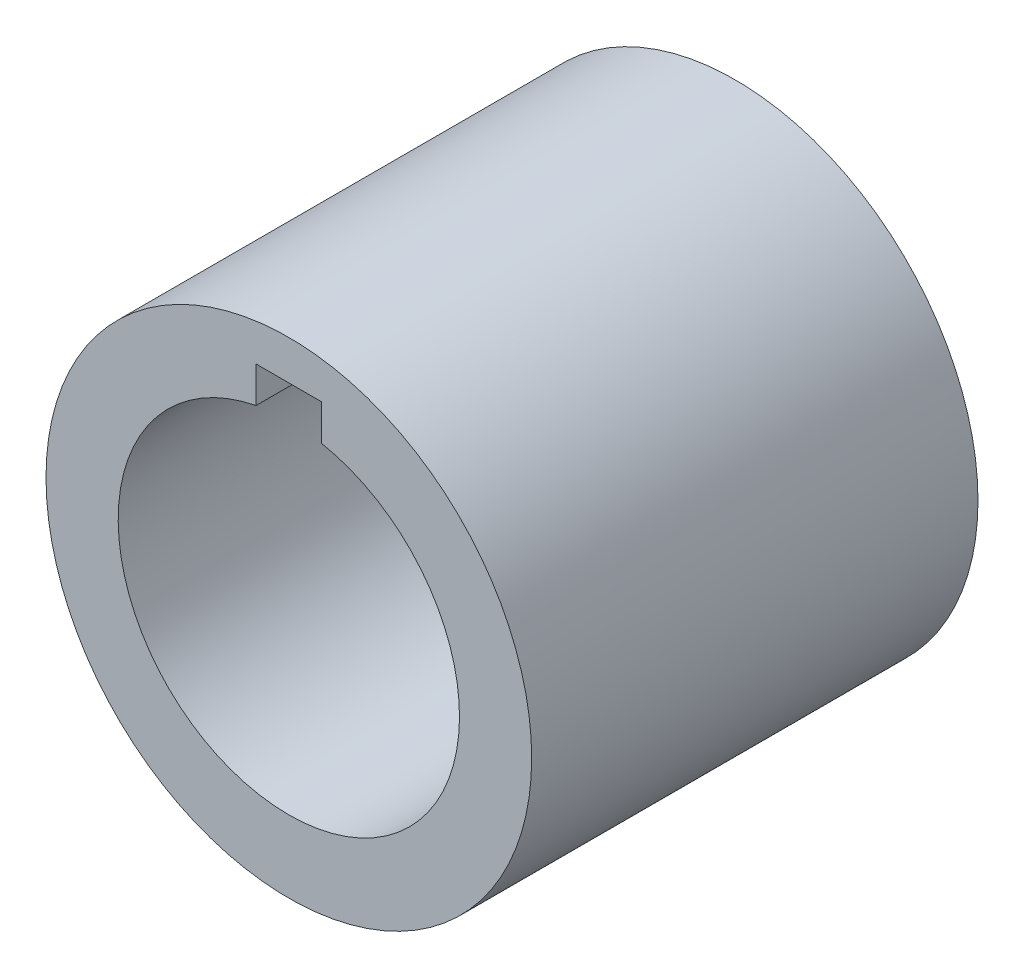
ISO-10303-21;
HEADER;
FILE_DESCRIPTION(('STEP AP214'),'2;1');
FILE_NAME('part.step','',(''),(''),'','','');
FILE_SCHEMA(('AUTOMOTIVE_DESIGN { 1 0 10303 214 1 1 1 1 }'));
ENDSEC;
DATA;
#1=APPLICATION_CONTEXT('core data for automotive mechanical design processes');
#2=APPLICATION_PROTOCOL_DEFINITION('international standard','automotive_design',2000,#1);
#3=PRODUCT_CONTEXT('',#1,'mechanical');
#4=PRODUCT('Part','Part','',(#3));
#5=PRODUCT_RELATED_PRODUCT_CATEGORY('part','',(#4));
#6=PRODUCT_DEFINITION_FORMATION('','',#4);
#7=PRODUCT_DEFINITION_CONTEXT('part definition',#1,'design');
#8=PRODUCT_DEFINITION('design','',#6,#7);
#9=PRODUCT_DEFINITION_SHAPE('','',#8);
#10=(LENGTH_UNIT() NAMED_UNIT(*) SI_UNIT(.MILLI.,.METRE.));
#11=(NAMED_UNIT(*) PLANE_ANGLE_UNIT() SI_UNIT($,.RADIAN.));
#12=(NAMED_UNIT(*) SI_UNIT($,.STERADIAN.) SOLID_ANGLE_UNIT());
#13=UNCERTAINTY_MEASURE_WITH_UNIT(LENGTH_MEASURE(1.E-05),#10,'distance_accuracy_value','');
#14=(GEOMETRIC_REPRESENTATION_CONTEXT(3) GLOBAL_UNCERTAINTY_ASSIGNED_CONTEXT((#13)) GLOBAL_UNIT_ASSIGNED_CONTEXT((#10,
#11,#12)) REPRESENTATION_CONTEXT('',''));
#15=CARTESIAN_POINT('',(0.,0.,0.));
#16=DIRECTION('',(0.,0.,1.));
#17=DIRECTION('',(1.,0.,0.));
#18=AXIS2_PLACEMENT_3D('',#15,#16,#17);
#19=CARTESIAN_POINT('',(0.,0.,34.));
#20=DIRECTION('',(0.,0.,1.));
#21=DIRECTION('',(1.,0.,0.));
#22=AXIS2_PLACEMENT_3D('',#19,#20,#21);
#23=PLANE('',#22);
#24=DIRECTION('',(0.,-1.,0.));
#25=VECTOR('',#24,1.);
#26=CARTESIAN_POINT('',(-2.5,15.5,34.));
#27=LINE('',#26,#25);
#28=CARTESIAN_POINT('',(-2.5,15.5,34.));
#29=VERTEX_POINT('',#28);
#30=CARTESIAN_POINT('',(-2.5,12.7573508221731,34.));
#31=VERTEX_POINT('',#30);
#32=EDGE_CURVE('E114',#29,#31,#27,.T.);
#33=ORIENTED_EDGE('',*,*,#32,.F.);
#34=DIRECTION('',(-1.,0.,0.));
#35=VECTOR('',#34,1.);
#36=CARTESIAN_POINT('',(2.5,15.5,34.));
#37=LINE('',#36,#35);
#38=CARTESIAN_POINT('',(2.5,15.5,34.));
#39=VERTEX_POINT('',#38);
#40=EDGE_CURVE('E96',#39,#29,#37,.T.);
#41=ORIENTED_EDGE('',*,*,#40,.F.);
#42=DIRECTION('',(0.,1.,0.));
#43=VECTOR('',#42,1.);
#44=CARTESIAN_POINT('',(2.5,15.5,34.));
#45=LINE('',#44,#43);
#46=CARTESIAN_POINT('',(2.5,12.7573508221731,34.));
#47=VERTEX_POINT('',#46);
#48=EDGE_CURVE('E106',#47,#39,#45,.T.);
#49=ORIENTED_EDGE('',*,*,#48,.F.);
#50=CARTESIAN_POINT('',(0.,0.,34.));
#51=DIRECTION('',(0.,0.,1.));
#52=DIRECTION('',(1.,0.,0.));
#53=AXIS2_PLACEMENT_3D('',#50,#51,#52);
#54=CIRCLE('',#53,13.);
#55=EDGE_CURVE('E124',#31,#47,#54,.T.);
#56=ORIENTED_EDGE('',*,*,#55,.F.);
#57=EDGE_LOOP('',(#33,#41,#49,#56));
#58=FACE_BOUND('',#57,.T.);
#59=CARTESIAN_POINT('',(0.,0.,34.));
#60=DIRECTION('',(0.,0.,1.));
#61=DIRECTION('',(1.,0.,0.));
#62=AXIS2_PLACEMENT_3D('',#59,#60,#61);
#63=CIRCLE('',#62,18.5);
#64=CARTESIAN_POINT('',(18.5,0.,34.));
#65=VERTEX_POINT('',#64);
#66=EDGE_CURVE('E131',#65,#65,#63,.T.);
#67=ORIENTED_EDGE('',*,*,#66,.T.);
#68=EDGE_LOOP('',(#67));
#69=FACE_BOUND('',#68,.T.);
#70=ADVANCED_FACE('F39',(#58,#69),#23,.T.);
#71=CARTESIAN_POINT('',(0.,0.,0.));
#72=DIRECTION('',(0.,0.,1.));
#73=DIRECTION('',(1.,0.,0.));
#74=AXIS2_PLACEMENT_3D('',#71,#72,#73);
#75=PLANE('',#74);
#76=CARTESIAN_POINT('',(0.,0.,0.));
#77=DIRECTION('',(0.,0.,1.));
#78=DIRECTION('',(1.,0.,0.));
#79=AXIS2_PLACEMENT_3D('',#76,#77,#78);
#80=CIRCLE('',#79,18.5);
#81=CARTESIAN_POINT('',(18.5,0.,0.));
#82=VERTEX_POINT('',#81);
#83=EDGE_CURVE('E127',#82,#82,#80,.T.);
#84=ORIENTED_EDGE('',*,*,#83,.F.);
#85=EDGE_LOOP('',(#84));
#86=FACE_BOUND('',#85,.T.);
#87=CARTESIAN_POINT('',(0.,0.,0.));
#88=DIRECTION('',(0.,0.,1.));
#89=DIRECTION('',(1.,0.,0.));
#90=AXIS2_PLACEMENT_3D('',#87,#88,#89);
#91=CIRCLE('',#90,13.);
#92=CARTESIAN_POINT('',(13.,0.,0.));
#93=VERTEX_POINT('',#92);
#94=EDGE_CURVE('E122',#93,#93,#91,.T.);
#95=ORIENTED_EDGE('',*,*,#94,.T.);
#96=EDGE_LOOP('',(#95));
#97=FACE_BOUND('',#96,.T.);
#98=ADVANCED_FACE('F173',(#86,#97),#75,.F.);
#99=CARTESIAN_POINT('',(0.,0.,34.));
#100=DIRECTION('',(0.,0.,-1.));
#101=DIRECTION('',(-1.,0.,0.));
#102=AXIS2_PLACEMENT_3D('',#99,#100,#101);
#103=CYLINDRICAL_SURFACE('',#102,18.5);
#104=ORIENTED_EDGE('',*,*,#66,.F.);
#105=EDGE_LOOP('',(#104));
#106=FACE_BOUND('',#105,.T.);
#107=ORIENTED_EDGE('',*,*,#83,.T.);
#108=EDGE_LOOP('',(#107));
#109=FACE_BOUND('',#108,.T.);
#110=ADVANCED_FACE('F168',(#106,#109),#103,.T.);
#111=CARTESIAN_POINT('',(0.,0.,34.));
#112=DIRECTION('',(0.,0.,-1.));
#113=DIRECTION('',(-1.,0.,0.));
#114=AXIS2_PLACEMENT_3D('',#111,#112,#113);
#115=CYLINDRICAL_SURFACE('',#114,13.);
#116=DIRECTION('',(0.,0.,-1.));
#117=VECTOR('',#116,1.);
#118=CARTESIAN_POINT('',(-2.5,12.7573508221731,34.));
#119=LINE('',#118,#117);
#120=CARTESIAN_POINT('',(-2.5,12.7573508221731,11.));
#121=VERTEX_POINT('',#120);
#122=EDGE_CURVE('E140',#31,#121,#119,.T.);
#123=ORIENTED_EDGE('',*,*,#122,.F.);
#124=ORIENTED_EDGE('',*,*,#55,.T.);
#125=DIRECTION('',(0.,0.,-1.));
#126=VECTOR('',#125,1.);
#127=CARTESIAN_POINT('',(2.5,12.7573508221731,34.));
#128=LINE('',#127,#126);
#129=CARTESIAN_POINT('',(2.5,12.7573508221731,11.));
#130=VERTEX_POINT('',#129);
#131=EDGE_CURVE('E109',#130,#47,#128,.F.);
#132=ORIENTED_EDGE('',*,*,#131,.F.);
#133=CARTESIAN_POINT('',(2.5,12.7573508221731,11.));
#134=CARTESIAN_POINT('',(2.50000749313691,12.7573450456409,10.930376957072));
#135=CARTESIAN_POINT('',(2.49709166098617,12.7579206462572,10.8607580089415));
#136=CARTESIAN_POINT('',(2.48547145414317,12.7601918390304,10.7220312456797));
#137=CARTESIAN_POINT('',(2.47676776215773,12.7618872990942,10.6529233712367));
#138=CARTESIAN_POINT('',(2.45364748353869,12.7663520747255,10.5158092137985));
#139=CARTESIAN_POINT('',(2.43923959093869,12.7691197559345,10.4478014175543));
#140=CARTESIAN_POINT('',(2.40483770151565,12.7756432139378,10.3132816422245));
#141=CARTESIAN_POINT('',(2.38484368928942,12.7793989934566,10.2467696672642));
#142=CARTESIAN_POINT('',(2.31667750071129,12.7919964341431,10.0501559423817));
#143=CARTESIAN_POINT('',(2.2603037839262,12.80217176971,9.9228740481664));
#144=CARTESIAN_POINT('',(2.12740627976695,12.8249232742152,9.67962717099967));
#145=CARTESIAN_POINT('',(2.05088032490189,12.8374997013649,9.56366340721926));
#146=CARTESIAN_POINT('',(1.87877941932844,12.8638188423628,9.34477119982209));
#147=CARTESIAN_POINT('',(1.78299416067924,12.8775733744673,9.24200923954284));
#148=CARTESIAN_POINT('',(1.5755353952948,12.9045964183195,9.05390123355371));
#149=CARTESIAN_POINT('',(1.46385889083329,12.9178648377716,8.96855848121636));
#150=CARTESIAN_POINT('',(1.22666942977458,12.9425500482732,8.81705440486016));
#151=CARTESIAN_POINT('',(1.10104960510487,12.9539506053294,8.75105768292481));
#152=CARTESIAN_POINT('',(0.840278199807231,12.9734720681168,8.64120465174492));
#153=CARTESIAN_POINT('',(0.705133292437257,12.9815952436673,8.59733301402814));
#154=CARTESIAN_POINT('',(0.474348960723125,12.9916763215095,8.54355798835741));
#155=CARTESIAN_POINT('',(0.380203770367686,12.9947809890247,8.52724231246427));
#156=CARTESIAN_POINT('',(0.190720733945989,12.9989498901616,8.50546011416931));
#157=CARTESIAN_POINT('',(0.0953842056251672,13.0000162066249,8.49998251692805));
#158=CARTESIAN_POINT('',(0.,13.,8.5));
#159=B_SPLINE_CURVE_WITH_KNOTS('',3,(#133,#134,#135,#136,#137,#138,#139,#140,#141,#142,#143,
#144,#145,#146,#147,#148,#149,#150,#151,#152,#153,#154,#155,#156,#157,#158),.UNSPECIFIED.,.F.,
.F.,(4,2,2,2,2,2,2,2,2,2,2,2,4),(0.,0.208798548816819,0.417572473175492,0.626029413116567,
0.834486927863297,1.25109426096649,1.66774642093583,2.08922298904812,2.51077917020598,
2.93582438105269,3.36057471053015,3.64676594828118,3.93266459152719),.UNSPECIFIED.);
#160=CARTESIAN_POINT('',(0.,13.,8.5));
#161=VERTEX_POINT('',#160);
#162=EDGE_CURVE('E152',#130,#161,#159,.T.);
#163=ORIENTED_EDGE('',*,*,#162,.T.);
#164=CARTESIAN_POINT('',(0.,13.,8.5));
#165=CARTESIAN_POINT('',(-0.0696350982249745,13.0000053696555,8.49999253561054));
#166=CARTESIAN_POINT('',(-0.139266168911171,12.9994406117374,8.50290934907913));
#167=CARTESIAN_POINT('',(-0.278017859484946,12.9972105966023,8.51453367263625));
#168=CARTESIAN_POINT('',(-0.347138536399277,12.9955454642716,8.5232405255884));
#169=CARTESIAN_POINT('',(-0.484280716143669,12.9911577141623,8.54636983086627));
#170=CARTESIAN_POINT('',(-0.552303704700347,12.9884366774137,8.56078373854093));
#171=CARTESIAN_POINT('',(-0.686854055750211,12.982017458871,8.5952005673537));
#172=CARTESIAN_POINT('',(-0.753381415760474,12.9783192754549,8.61520349776952));
#173=CARTESIAN_POINT('',(-0.950043599142356,12.9659012213978,8.68340204917518));
#174=CARTESIAN_POINT('',(-1.07735803818003,12.9558544471542,8.73980433975833));
#175=CARTESIAN_POINT('',(-1.32065864288852,12.9333231394576,8.87276862332707));
#176=CARTESIAN_POINT('',(-1.43664373519328,12.9208383753597,8.94933252393105));
#177=CARTESIAN_POINT('',(-1.6555116954017,12.8946332718273,9.121472025275));
#178=CARTESIAN_POINT('',(-1.75823468557063,12.880900746432,9.2172493908552));
#179=CARTESIAN_POINT('',(-1.94626757151752,12.853835759928,9.42467630545583));
#180=CARTESIAN_POINT('',(-2.03157398282963,12.8405033793289,9.53632902302985));
#181=CARTESIAN_POINT('',(-2.18303927866319,12.8156271907884,9.77349690144004));
#182=CARTESIAN_POINT('',(-2.24902708584108,12.8040997603598,9.89912307900289));
#183=CARTESIAN_POINT('',(-2.35886147115159,12.7843226805859,10.1599072959036));
#184=CARTESIAN_POINT('',(-2.40272365005539,12.7760707225839,10.2950585422699));
#185=CARTESIAN_POINT('',(-2.45647257870081,12.7658227606657,10.5258169151146));
#186=CARTESIAN_POINT('',(-2.47277651475444,12.7626638624849,10.6199276268343));
#187=CARTESIAN_POINT('',(-2.49454356996108,12.7584201927736,10.8093437616093));
#188=CARTESIAN_POINT('',(-2.50001754382728,12.7573333444976,10.9046478919777));
#189=CARTESIAN_POINT('',(-2.5,12.7573508221731,11.));
#190=B_SPLINE_CURVE_WITH_KNOTS('',3,(#164,#165,#166,#167,#168,#169,#170,#171,#172,#173,#174,
#175,#176,#177,#178,#179,#180,#181,#182,#183,#184,#185,#186,#187,#188,#189),.UNSPECIFIED.,.F.,
.F.,(4,2,2,2,2,2,2,2,2,2,2,2,4),(0.,0.208834879826145,0.417646062131662,0.626145785626669,
0.834645855230743,1.25134681942882,1.66808722453537,2.08945750226652,2.5109119994459,
2.93599303641877,3.36077392850344,3.64686261271974,3.93266440886109),.UNSPECIFIED.);
#191=EDGE_CURVE('E11',#161,#121,#190,.T.);
#192=ORIENTED_EDGE('',*,*,#191,.T.);
#193=EDGE_LOOP('',(#123,#124,#132,#163,#192));
#194=FACE_BOUND('',#193,.T.);
#195=ORIENTED_EDGE('',*,*,#94,.F.);
#196=EDGE_LOOP('',(#195));
#197=FACE_BOUND('',#196,.T.);
#198=ADVANCED_FACE('F162',(#194,#197),#115,.F.);
#199=CARTESIAN_POINT('',(-2.5,15.5,8.5));
#200=DIRECTION('',(-1.,0.,0.));
#201=DIRECTION('',(0.,-1.,0.));
#202=AXIS2_PLACEMENT_3D('',#199,#200,#201);
#203=PLANE('',#202);
#204=ORIENTED_EDGE('',*,*,#122,.T.);
#205=DIRECTION('',(0.,-1.,0.));
#206=VECTOR('',#205,1.);
#207=CARTESIAN_POINT('',(-2.5,15.5,11.));
#208=LINE('',#207,#206);
#209=CARTESIAN_POINT('',(-2.5,15.5,11.));
#210=VERTEX_POINT('',#209);
#211=EDGE_CURVE('E61',#121,#210,#208,.F.);
#212=ORIENTED_EDGE('',*,*,#211,.T.);
#213=DIRECTION('',(0.,0.,1.));
#214=VECTOR('',#213,1.);
#215=CARTESIAN_POINT('',(-2.5,15.5,8.5));
#216=LINE('',#215,#214);
#217=EDGE_CURVE('E103',#210,#29,#216,.T.);
#218=ORIENTED_EDGE('',*,*,#217,.T.);
#219=ORIENTED_EDGE('',*,*,#32,.T.);
#220=EDGE_LOOP('',(#204,#212,#218,#219));
#221=FACE_BOUND('',#220,.T.);
#222=ADVANCED_FACE('F167',(#221),#203,.F.);
#223=CARTESIAN_POINT('',(2.5,15.5,8.5));
#224=DIRECTION('',(0.,1.,0.));
#225=DIRECTION('',(0.,0.,1.));
#226=AXIS2_PLACEMENT_3D('',#223,#224,#225);
#227=PLANE('',#226);
#228=ORIENTED_EDGE('',*,*,#217,.F.);
#229=CARTESIAN_POINT('',(0.,15.5,11.));
#230=DIRECTION('',(0.,1.,0.));
#231=DIRECTION('',(0.,0.,1.));
#232=AXIS2_PLACEMENT_3D('',#229,#230,#231);
#233=CIRCLE('',#232,2.5);
#234=CARTESIAN_POINT('',(0.,15.5,8.5));
#235=VERTEX_POINT('',#234);
#236=EDGE_CURVE('E54',#210,#235,#233,.F.);
#237=ORIENTED_EDGE('',*,*,#236,.T.);
#238=CARTESIAN_POINT('',(0.,15.5,11.));
#239=DIRECTION('',(0.,1.,0.));
#240=DIRECTION('',(0.,0.,1.));
#241=AXIS2_PLACEMENT_3D('',#238,#239,#240);
#242=CIRCLE('',#241,2.5);
#243=CARTESIAN_POINT('',(2.5,15.5,11.));
#244=VERTEX_POINT('',#243);
#245=EDGE_CURVE('E99',#235,#244,#242,.F.);
#246=ORIENTED_EDGE('',*,*,#245,.T.);
#247=DIRECTION('',(0.,0.,1.));
#248=VECTOR('',#247,1.);
#249=CARTESIAN_POINT('',(2.5,15.5,8.5));
#250=LINE('',#249,#248);
#251=EDGE_CURVE('E92',#244,#39,#250,.T.);
#252=ORIENTED_EDGE('',*,*,#251,.T.);
#253=ORIENTED_EDGE('',*,*,#40,.T.);
#254=EDGE_LOOP('',(#228,#237,#246,#252,#253));
#255=FACE_BOUND('',#254,.T.);
#256=ADVANCED_FACE('F94',(#255),#227,.F.);
#257=CARTESIAN_POINT('',(2.5,15.5,8.5));
#258=DIRECTION('',(1.,0.,0.));
#259=DIRECTION('',(0.,1.,0.));
#260=AXIS2_PLACEMENT_3D('',#257,#258,#259);
#261=PLANE('',#260);
#262=ORIENTED_EDGE('',*,*,#251,.F.);
#263=DIRECTION('',(0.,1.,0.));
#264=VECTOR('',#263,1.);
#265=CARTESIAN_POINT('',(2.5,12.7573508221731,11.));
#266=LINE('',#265,#264);
#267=EDGE_CURVE('E149',#244,#130,#266,.F.);
#268=ORIENTED_EDGE('',*,*,#267,.T.);
#269=ORIENTED_EDGE('',*,*,#131,.T.);
#270=ORIENTED_EDGE('',*,*,#48,.T.);
#271=EDGE_LOOP('',(#262,#268,#269,#270));
#272=FACE_BOUND('',#271,.T.);
#273=ADVANCED_FACE('F107',(#272),#261,.F.);
#274=CARTESIAN_POINT('',(0.,0.,11.));
#275=DIRECTION('',(0.,-1.,0.));
#276=DIRECTION('',(1.,0.,0.));
#277=AXIS2_PLACEMENT_3D('',#274,#275,#276);
#278=CYLINDRICAL_SURFACE('',#277,2.5);
#279=ORIENTED_EDGE('',*,*,#162,.F.);
#280=ORIENTED_EDGE('',*,*,#267,.F.);
#281=ORIENTED_EDGE('',*,*,#245,.F.);
#282=DIRECTION('',(0.,1.,0.));
#283=VECTOR('',#282,1.);
#284=CARTESIAN_POINT('',(0.,15.5,8.5));
#285=LINE('',#284,#283);
#286=EDGE_CURVE('E143',#161,#235,#285,.T.);
#287=ORIENTED_EDGE('',*,*,#286,.F.);
#288=EDGE_LOOP('',(#279,#280,#281,#287));
#289=FACE_BOUND('',#288,.T.);
#290=ADVANCED_FACE('F159',(#289),#278,.F.);
#291=CARTESIAN_POINT('',(0.,0.,11.));
#292=DIRECTION('',(0.,1.,0.));
#293=DIRECTION('',(-1.,0.,0.));
#294=AXIS2_PLACEMENT_3D('',#291,#292,#293);
#295=CYLINDRICAL_SURFACE('',#294,2.5);
#296=ORIENTED_EDGE('',*,*,#236,.F.);
#297=ORIENTED_EDGE('',*,*,#211,.F.);
#298=ORIENTED_EDGE('',*,*,#191,.F.);
#299=ORIENTED_EDGE('',*,*,#286,.T.);
#300=EDGE_LOOP('',(#296,#297,#298,#299));
#301=FACE_BOUND('',#300,.T.);
#302=ADVANCED_FACE('F41',(#301),#295,.F.);
#303=CLOSED_SHELL('',(#70,#98,#110,#198,#222,#256,#273,#290,#302));
#304=MANIFOLD_SOLID_BREP('B2',#303);
#305=ADVANCED_BREP_SHAPE_REPRESENTATION('',(#18,#304),#14);
#306=SHAPE_DEFINITION_REPRESENTATION(#9,#305);
ENDSEC;
END-ISO-10303-21;
